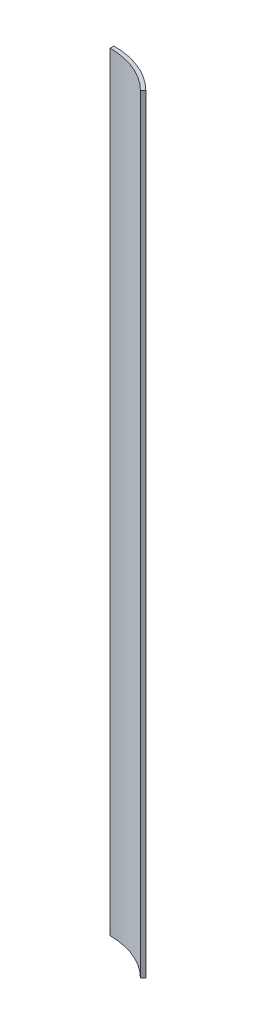
ISO-10303-21;
HEADER;
FILE_DESCRIPTION(('STEP AP214'),'2;1');
FILE_NAME('part.step','',(''),(''),'','','');
FILE_SCHEMA(('AUTOMOTIVE_DESIGN { 1 0 10303 214 1 1 1 1 }'));
ENDSEC;
DATA;
#1=APPLICATION_CONTEXT('core data for automotive mechanical design processes');
#2=APPLICATION_PROTOCOL_DEFINITION('international standard','automotive_design',2000,#1);
#3=PRODUCT_CONTEXT('',#1,'mechanical');
#4=PRODUCT('Part','Part','',(#3));
#5=PRODUCT_RELATED_PRODUCT_CATEGORY('part','',(#4));
#6=PRODUCT_DEFINITION_FORMATION('','',#4);
#7=PRODUCT_DEFINITION_CONTEXT('part definition',#1,'design');
#8=PRODUCT_DEFINITION('design','',#6,#7);
#9=PRODUCT_DEFINITION_SHAPE('','',#8);
#10=(LENGTH_UNIT() NAMED_UNIT(*) SI_UNIT(.MILLI.,.METRE.));
#11=(NAMED_UNIT(*) PLANE_ANGLE_UNIT() SI_UNIT($,.RADIAN.));
#12=(NAMED_UNIT(*) SI_UNIT($,.STERADIAN.) SOLID_ANGLE_UNIT());
#13=UNCERTAINTY_MEASURE_WITH_UNIT(LENGTH_MEASURE(1.E-05),#10,'distance_accuracy_value','');
#14=(GEOMETRIC_REPRESENTATION_CONTEXT(3) GLOBAL_UNCERTAINTY_ASSIGNED_CONTEXT((#13)) GLOBAL_UNIT_ASSIGNED_CONTEXT((#10,
#11,#12)) REPRESENTATION_CONTEXT('',''));
#15=CARTESIAN_POINT('',(0.,0.,0.));
#16=DIRECTION('',(0.,0.,1.));
#17=DIRECTION('',(1.,0.,0.));
#18=AXIS2_PLACEMENT_3D('',#15,#16,#17);
#19=CARTESIAN_POINT('',(0.,254.,0.));
#20=DIRECTION('',(0.,-1.,0.));
#21=DIRECTION('',(0.,0.,-1.));
#22=AXIS2_PLACEMENT_3D('',#19,#20,#21);
#23=CYLINDRICAL_SURFACE('',#22,25.4);
#24=CARTESIAN_POINT('',(0.,0.,0.));
#25=DIRECTION('',(0.,1.,0.));
#26=DIRECTION('',(0.,0.,-1.));
#27=AXIS2_PLACEMENT_3D('',#24,#25,#26);
#28=CIRCLE('',#27,25.4);
#29=CARTESIAN_POINT('',(17.9605122421383,0.,-17.9605122421383));
#30=VERTEX_POINT('',#29);
#31=CARTESIAN_POINT('',(0.,0.,-25.4));
#32=VERTEX_POINT('',#31);
#33=EDGE_CURVE('E96',#30,#32,#28,.T.);
#34=ORIENTED_EDGE('',*,*,#33,.T.);
#35=DIRECTION('',(0.,-1.,0.));
#36=VECTOR('',#35,1.);
#37=CARTESIAN_POINT('',(0.,254.,-25.4));
#38=LINE('',#37,#36);
#39=CARTESIAN_POINT('',(0.,254.,-25.4));
#40=VERTEX_POINT('',#39);
#41=EDGE_CURVE('E11',#40,#32,#38,.T.);
#42=ORIENTED_EDGE('',*,*,#41,.F.);
#43=CARTESIAN_POINT('',(0.,254.,0.));
#44=DIRECTION('',(0.,1.,0.));
#45=DIRECTION('',(0.,0.,-1.));
#46=AXIS2_PLACEMENT_3D('',#43,#44,#45);
#47=CIRCLE('',#46,25.4);
#48=CARTESIAN_POINT('',(17.9605122421383,254.,-17.9605122421383));
#49=VERTEX_POINT('',#48);
#50=EDGE_CURVE('E84',#49,#40,#47,.T.);
#51=ORIENTED_EDGE('',*,*,#50,.F.);
#52=DIRECTION('',(0.,-1.,0.));
#53=VECTOR('',#52,1.);
#54=CARTESIAN_POINT('',(17.9605122421383,254.,-17.9605122421383));
#55=LINE('',#54,#53);
#56=EDGE_CURVE('E92',#49,#30,#55,.T.);
#57=ORIENTED_EDGE('',*,*,#56,.T.);
#58=EDGE_LOOP('',(#34,#42,#51,#57));
#59=FACE_BOUND('',#58,.T.);
#60=ADVANCED_FACE('F33',(#59),#23,.T.);
#61=CARTESIAN_POINT('',(0.,254.,-24.13));
#62=DIRECTION('',(1.,0.,0.));
#63=DIRECTION('',(0.,0.,-1.));
#64=AXIS2_PLACEMENT_3D('',#61,#62,#63);
#65=PLANE('',#64);
#66=DIRECTION('',(0.,0.,1.));
#67=VECTOR('',#66,1.);
#68=CARTESIAN_POINT('',(0.,0.,-24.13));
#69=LINE('',#68,#67);
#70=CARTESIAN_POINT('',(0.,0.,-24.13));
#71=VERTEX_POINT('',#70);
#72=EDGE_CURVE('E88',#32,#71,#69,.T.);
#73=ORIENTED_EDGE('',*,*,#72,.T.);
#74=DIRECTION('',(0.,-1.,0.));
#75=VECTOR('',#74,1.);
#76=CARTESIAN_POINT('',(0.,254.,-24.13));
#77=LINE('',#76,#75);
#78=CARTESIAN_POINT('',(0.,254.,-24.13));
#79=VERTEX_POINT('',#78);
#80=EDGE_CURVE('E41',#79,#71,#77,.T.);
#81=ORIENTED_EDGE('',*,*,#80,.F.);
#82=DIRECTION('',(0.,0.,1.));
#83=VECTOR('',#82,1.);
#84=CARTESIAN_POINT('',(0.,254.,-24.13));
#85=LINE('',#84,#83);
#86=EDGE_CURVE('E79',#40,#79,#85,.T.);
#87=ORIENTED_EDGE('',*,*,#86,.F.);
#88=ORIENTED_EDGE('',*,*,#41,.T.);
#89=EDGE_LOOP('',(#73,#81,#87,#88));
#90=FACE_BOUND('',#89,.T.);
#91=ADVANCED_FACE('F87',(#90),#65,.F.);
#92=CARTESIAN_POINT('',(0.,254.,0.));
#93=DIRECTION('',(0.,-1.,0.));
#94=DIRECTION('',(0.,0.,-1.));
#95=AXIS2_PLACEMENT_3D('',#92,#93,#94);
#96=CYLINDRICAL_SURFACE('',#95,24.13);
#97=CARTESIAN_POINT('',(0.,0.,0.));
#98=DIRECTION('',(0.,-1.,0.));
#99=DIRECTION('',(0.,0.,-1.));
#100=AXIS2_PLACEMENT_3D('',#97,#98,#99);
#101=CIRCLE('',#100,24.13);
#102=CARTESIAN_POINT('',(17.0624866300314,0.,-17.0624866300314));
#103=VERTEX_POINT('',#102);
#104=EDGE_CURVE('E66',#71,#103,#101,.T.);
#105=ORIENTED_EDGE('',*,*,#104,.T.);
#106=DIRECTION('',(0.,-1.,0.));
#107=VECTOR('',#106,1.);
#108=CARTESIAN_POINT('',(17.0624866300314,254.,-17.0624866300314));
#109=LINE('',#108,#107);
#110=CARTESIAN_POINT('',(17.0624866300314,254.,-17.0624866300314));
#111=VERTEX_POINT('',#110);
#112=EDGE_CURVE('E89',#111,#103,#109,.T.);
#113=ORIENTED_EDGE('',*,*,#112,.F.);
#114=CARTESIAN_POINT('',(0.,254.,0.));
#115=DIRECTION('',(0.,-1.,0.));
#116=DIRECTION('',(0.,0.,-1.));
#117=AXIS2_PLACEMENT_3D('',#114,#115,#116);
#118=CIRCLE('',#117,24.13);
#119=EDGE_CURVE('E82',#79,#111,#118,.T.);
#120=ORIENTED_EDGE('',*,*,#119,.F.);
#121=ORIENTED_EDGE('',*,*,#80,.T.);
#122=EDGE_LOOP('',(#105,#113,#120,#121));
#123=FACE_BOUND('',#122,.T.);
#124=ADVANCED_FACE('F90',(#123),#96,.F.);
#125=CARTESIAN_POINT('',(17.0624866300314,254.,-17.0624866300314));
#126=DIRECTION('',(-0.707106781186545,0.,-0.70710678118655));
#127=DIRECTION('',(-0.70710678118655,0.,0.707106781186545));
#128=AXIS2_PLACEMENT_3D('',#125,#126,#127);
#129=PLANE('',#128);
#130=DIRECTION('',(0.70710678118655,0.,-0.707106781186545));
#131=VECTOR('',#130,1.);
#132=CARTESIAN_POINT('',(17.0624866300314,0.,-17.0624866300314));
#133=LINE('',#132,#131);
#134=EDGE_CURVE('E72',#103,#30,#133,.T.);
#135=ORIENTED_EDGE('',*,*,#134,.T.);
#136=ORIENTED_EDGE('',*,*,#56,.F.);
#137=DIRECTION('',(0.70710678118655,0.,-0.707106781186545));
#138=VECTOR('',#137,1.);
#139=CARTESIAN_POINT('',(17.0624866300314,254.,-17.0624866300314));
#140=LINE('',#139,#138);
#141=EDGE_CURVE('E49',#111,#49,#140,.T.);
#142=ORIENTED_EDGE('',*,*,#141,.F.);
#143=ORIENTED_EDGE('',*,*,#112,.T.);
#144=EDGE_LOOP('',(#135,#136,#142,#143));
#145=FACE_BOUND('',#144,.T.);
#146=ADVANCED_FACE('F103',(#145),#129,.F.);
#147=CARTESIAN_POINT('',(0.,254.,0.));
#148=DIRECTION('',(0.,-1.,0.));
#149=DIRECTION('',(0.,0.,-1.));
#150=AXIS2_PLACEMENT_3D('',#147,#148,#149);
#151=PLANE('',#150);
#152=ORIENTED_EDGE('',*,*,#50,.T.);
#153=ORIENTED_EDGE('',*,*,#86,.T.);
#154=ORIENTED_EDGE('',*,*,#119,.T.);
#155=ORIENTED_EDGE('',*,*,#141,.T.);
#156=EDGE_LOOP('',(#152,#153,#154,#155));
#157=FACE_BOUND('',#156,.T.);
#158=ADVANCED_FACE('F80',(#157),#151,.F.);
#159=CARTESIAN_POINT('',(0.,0.,0.));
#160=DIRECTION('',(0.,-1.,0.));
#161=DIRECTION('',(0.,0.,-1.));
#162=AXIS2_PLACEMENT_3D('',#159,#160,#161);
#163=PLANE('',#162);
#164=ORIENTED_EDGE('',*,*,#33,.F.);
#165=ORIENTED_EDGE('',*,*,#134,.F.);
#166=ORIENTED_EDGE('',*,*,#104,.F.);
#167=ORIENTED_EDGE('',*,*,#72,.F.);
#168=EDGE_LOOP('',(#164,#165,#166,#167));
#169=FACE_BOUND('',#168,.T.);
#170=ADVANCED_FACE('F106',(#169),#163,.T.);
#171=CLOSED_SHELL('',(#60,#91,#124,#146,#158,#170));
#172=MANIFOLD_SOLID_BREP('B2',#171);
#173=ADVANCED_BREP_SHAPE_REPRESENTATION('',(#18,#172),#14);
#174=SHAPE_DEFINITION_REPRESENTATION(#9,#173);
ENDSEC;
END-ISO-10303-21;
